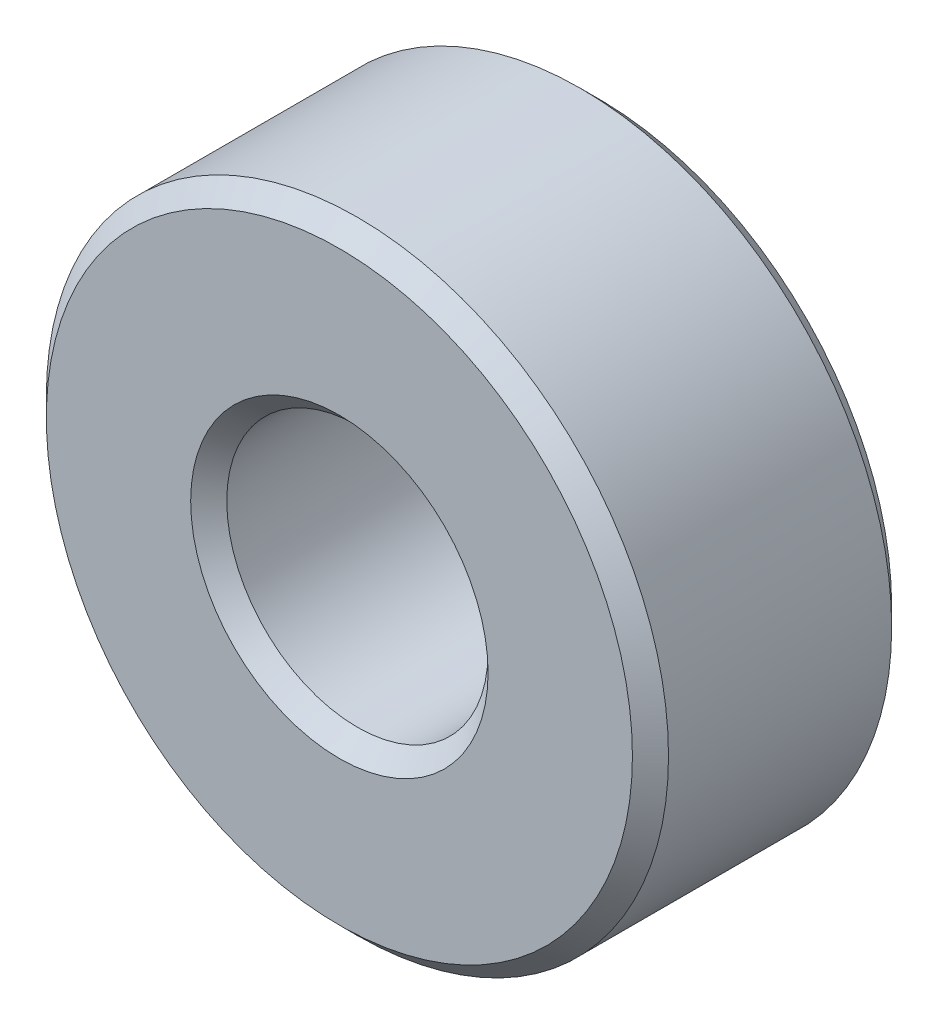
ISO-10303-21;
HEADER;
FILE_DESCRIPTION(('STEP AP214'),'2;1');
FILE_NAME('part.step','',(''),(''),'','','');
FILE_SCHEMA(('AUTOMOTIVE_DESIGN { 1 0 10303 214 1 1 1 1 }'));
ENDSEC;
DATA;
#1=APPLICATION_CONTEXT('core data for automotive mechanical design processes');
#2=APPLICATION_PROTOCOL_DEFINITION('international standard','automotive_design',2000,#1);
#3=PRODUCT_CONTEXT('',#1,'mechanical');
#4=PRODUCT('Part','Part','',(#3));
#5=PRODUCT_RELATED_PRODUCT_CATEGORY('part','',(#4));
#6=PRODUCT_DEFINITION_FORMATION('','',#4);
#7=PRODUCT_DEFINITION_CONTEXT('part definition',#1,'design');
#8=PRODUCT_DEFINITION('design','',#6,#7);
#9=PRODUCT_DEFINITION_SHAPE('','',#8);
#10=(LENGTH_UNIT() NAMED_UNIT(*) SI_UNIT(.MILLI.,.METRE.));
#11=(NAMED_UNIT(*) PLANE_ANGLE_UNIT() SI_UNIT($,.RADIAN.));
#12=(NAMED_UNIT(*) SI_UNIT($,.STERADIAN.) SOLID_ANGLE_UNIT());
#13=UNCERTAINTY_MEASURE_WITH_UNIT(LENGTH_MEASURE(1.E-05),#10,'distance_accuracy_value','');
#14=(GEOMETRIC_REPRESENTATION_CONTEXT(3) GLOBAL_UNCERTAINTY_ASSIGNED_CONTEXT((#13)) GLOBAL_UNIT_ASSIGNED_CONTEXT((#10,
#11,#12)) REPRESENTATION_CONTEXT('',''));
#15=CARTESIAN_POINT('',(0.,0.,0.));
#16=DIRECTION('',(0.,0.,1.));
#17=DIRECTION('',(1.,0.,0.));
#18=AXIS2_PLACEMENT_3D('',#15,#16,#17);
#19=CARTESIAN_POINT('',(0.,0.,-3.96875));
#20=DIRECTION('',(0.,0.,1.));
#21=DIRECTION('',(1.,0.,0.));
#22=AXIS2_PLACEMENT_3D('',#19,#20,#21);
#23=CYLINDRICAL_SURFACE('',#22,9.525);
#24=CARTESIAN_POINT('',(0.,0.,3.4163));
#25=DIRECTION('',(0.,0.,1.));
#26=DIRECTION('',(1.,0.,0.));
#27=AXIS2_PLACEMENT_3D('',#24,#25,#26);
#28=CIRCLE('',#27,9.525);
#29=CARTESIAN_POINT('',(9.525,0.,3.4163));
#30=VERTEX_POINT('',#29);
#31=EDGE_CURVE('E70',#30,#30,#28,.F.);
#32=ORIENTED_EDGE('',*,*,#31,.T.);
#33=EDGE_LOOP('',(#32));
#34=FACE_BOUND('',#33,.T.);
#35=CARTESIAN_POINT('',(0.,0.,-3.4163));
#36=DIRECTION('',(0.,0.,1.));
#37=DIRECTION('',(1.,0.,0.));
#38=AXIS2_PLACEMENT_3D('',#35,#36,#37);
#39=CIRCLE('',#38,9.525);
#40=CARTESIAN_POINT('',(9.525,0.,-3.4163));
#41=VERTEX_POINT('',#40);
#42=EDGE_CURVE('E74',#41,#41,#39,.T.);
#43=ORIENTED_EDGE('',*,*,#42,.T.);
#44=EDGE_LOOP('',(#43));
#45=FACE_BOUND('',#44,.T.);
#46=ADVANCED_FACE('F44',(#34,#45),#23,.T.);
#47=CARTESIAN_POINT('',(0.,0.,-3.96875));
#48=DIRECTION('',(0.,0.,1.));
#49=DIRECTION('',(1.,0.,0.));
#50=AXIS2_PLACEMENT_3D('',#47,#48,#49);
#51=PLANE('',#50);
#52=CARTESIAN_POINT('',(0.,0.,-3.96875));
#53=DIRECTION('',(0.,0.,1.));
#54=DIRECTION('',(1.,0.,0.));
#55=AXIS2_PLACEMENT_3D('',#52,#53,#54);
#56=CIRCLE('',#55,8.97255);
#57=CARTESIAN_POINT('',(8.97255,0.,-3.96875));
#58=VERTEX_POINT('',#57);
#59=EDGE_CURVE('E58',#58,#58,#56,.F.);
#60=ORIENTED_EDGE('',*,*,#59,.T.);
#61=EDGE_LOOP('',(#60));
#62=FACE_BOUND('',#61,.T.);
#63=CARTESIAN_POINT('',(0.,0.,-3.96875));
#64=DIRECTION('',(0.,0.,1.));
#65=DIRECTION('',(1.,0.,0.));
#66=AXIS2_PLACEMENT_3D('',#63,#64,#65);
#67=CIRCLE('',#66,4.55295);
#68=CARTESIAN_POINT('',(4.55295,0.,-3.96875));
#69=VERTEX_POINT('',#68);
#70=EDGE_CURVE('E64',#69,#69,#67,.T.);
#71=ORIENTED_EDGE('',*,*,#70,.T.);
#72=EDGE_LOOP('',(#71));
#73=FACE_BOUND('',#72,.T.);
#74=ADVANCED_FACE('F103',(#62,#73),#51,.F.);
#75=CARTESIAN_POINT('',(0.,0.,-3.96875));
#76=DIRECTION('',(0.,0.,1.));
#77=DIRECTION('',(1.,0.,0.));
#78=AXIS2_PLACEMENT_3D('',#75,#76,#77);
#79=CYLINDRICAL_SURFACE('',#78,4.0005);
#80=CARTESIAN_POINT('',(0.,0.,3.4163));
#81=DIRECTION('',(0.,0.,1.));
#82=DIRECTION('',(1.,0.,0.));
#83=AXIS2_PLACEMENT_3D('',#80,#81,#82);
#84=CIRCLE('',#83,4.0005);
#85=CARTESIAN_POINT('',(4.0005,0.,3.4163));
#86=VERTEX_POINT('',#85);
#87=EDGE_CURVE('E10',#86,#86,#84,.T.);
#88=ORIENTED_EDGE('',*,*,#87,.T.);
#89=EDGE_LOOP('',(#88));
#90=FACE_BOUND('',#89,.T.);
#91=CARTESIAN_POINT('',(0.,0.,-3.4163));
#92=DIRECTION('',(0.,0.,1.));
#93=DIRECTION('',(1.,0.,0.));
#94=AXIS2_PLACEMENT_3D('',#91,#92,#93);
#95=CIRCLE('',#94,4.0005);
#96=CARTESIAN_POINT('',(4.0005,0.,-3.4163));
#97=VERTEX_POINT('',#96);
#98=EDGE_CURVE('E52',#97,#97,#95,.F.);
#99=ORIENTED_EDGE('',*,*,#98,.T.);
#100=EDGE_LOOP('',(#99));
#101=FACE_BOUND('',#100,.T.);
#102=ADVANCED_FACE('F109',(#90,#101),#79,.F.);
#103=CARTESIAN_POINT('',(0.,0.,3.96875));
#104=DIRECTION('',(0.,0.,1.));
#105=DIRECTION('',(1.,0.,0.));
#106=AXIS2_PLACEMENT_3D('',#103,#104,#105);
#107=PLANE('',#106);
#108=CARTESIAN_POINT('',(0.,0.,3.96875));
#109=DIRECTION('',(0.,0.,1.));
#110=DIRECTION('',(1.,0.,0.));
#111=AXIS2_PLACEMENT_3D('',#108,#109,#110);
#112=CIRCLE('',#111,8.97255);
#113=CARTESIAN_POINT('',(8.97255,0.,3.96875));
#114=VERTEX_POINT('',#113);
#115=EDGE_CURVE('E78',#114,#114,#112,.T.);
#116=ORIENTED_EDGE('',*,*,#115,.T.);
#117=EDGE_LOOP('',(#116));
#118=FACE_BOUND('',#117,.T.);
#119=CARTESIAN_POINT('',(0.,0.,3.96875));
#120=DIRECTION('',(0.,0.,1.));
#121=DIRECTION('',(1.,0.,0.));
#122=AXIS2_PLACEMENT_3D('',#119,#120,#121);
#123=CIRCLE('',#122,4.55295);
#124=CARTESIAN_POINT('',(4.55295,0.,3.96875));
#125=VERTEX_POINT('',#124);
#126=EDGE_CURVE('E82',#125,#125,#123,.F.);
#127=ORIENTED_EDGE('',*,*,#126,.T.);
#128=EDGE_LOOP('',(#127));
#129=FACE_BOUND('',#128,.T.);
#130=ADVANCED_FACE('F88',(#118,#129),#107,.T.);
#131=CARTESIAN_POINT('',(0.,0.,3.96875));
#132=DIRECTION('',(0.,0.,-1.));
#133=DIRECTION('',(-1.,0.,0.));
#134=AXIS2_PLACEMENT_3D('',#131,#132,#133);
#135=CONICAL_SURFACE('',#134,8.97255,0.785398163397445);
#136=ORIENTED_EDGE('',*,*,#31,.F.);
#137=EDGE_LOOP('',(#136));
#138=FACE_BOUND('',#137,.T.);
#139=ORIENTED_EDGE('',*,*,#115,.F.);
#140=EDGE_LOOP('',(#139));
#141=FACE_BOUND('',#140,.T.);
#142=ADVANCED_FACE('F99',(#138,#141),#135,.T.);
#143=CARTESIAN_POINT('',(0.,0.,-3.4163));
#144=DIRECTION('',(0.,0.,1.));
#145=DIRECTION('',(1.,0.,0.));
#146=AXIS2_PLACEMENT_3D('',#143,#144,#145);
#147=CONICAL_SURFACE('',#146,9.525,0.78539816339745);
#148=ORIENTED_EDGE('',*,*,#59,.F.);
#149=EDGE_LOOP('',(#148));
#150=FACE_BOUND('',#149,.T.);
#151=ORIENTED_EDGE('',*,*,#42,.F.);
#152=EDGE_LOOP('',(#151));
#153=FACE_BOUND('',#152,.T.);
#154=ADVANCED_FACE('F93',(#150,#153),#147,.T.);
#155=CARTESIAN_POINT('',(0.,0.,3.4163));
#156=DIRECTION('',(0.,0.,1.));
#157=DIRECTION('',(1.,0.,0.));
#158=AXIS2_PLACEMENT_3D('',#155,#156,#157);
#159=CONICAL_SURFACE('',#158,4.0005,0.785398163397451);
#160=ORIENTED_EDGE('',*,*,#126,.F.);
#161=EDGE_LOOP('',(#160));
#162=FACE_BOUND('',#161,.T.);
#163=ORIENTED_EDGE('',*,*,#87,.F.);
#164=EDGE_LOOP('',(#163));
#165=FACE_BOUND('',#164,.T.);
#166=ADVANCED_FACE('F90',(#162,#165),#159,.F.);
#167=CARTESIAN_POINT('',(0.,0.,-3.96875));
#168=DIRECTION('',(0.,0.,-1.));
#169=DIRECTION('',(-1.,0.,0.));
#170=AXIS2_PLACEMENT_3D('',#167,#168,#169);
#171=CONICAL_SURFACE('',#170,4.55295,0.785398163397446);
#172=ORIENTED_EDGE('',*,*,#98,.F.);
#173=EDGE_LOOP('',(#172));
#174=FACE_BOUND('',#173,.T.);
#175=ORIENTED_EDGE('',*,*,#70,.F.);
#176=EDGE_LOOP('',(#175));
#177=FACE_BOUND('',#176,.T.);
#178=ADVANCED_FACE('F46',(#174,#177),#171,.F.);
#179=CLOSED_SHELL('',(#46,#74,#102,#130,#142,#154,#166,#178));
#180=MANIFOLD_SOLID_BREP('B2',#179);
#181=ADVANCED_BREP_SHAPE_REPRESENTATION('',(#18,#180),#14);
#182=SHAPE_DEFINITION_REPRESENTATION(#9,#181);
ENDSEC;
END-ISO-10303-21;
